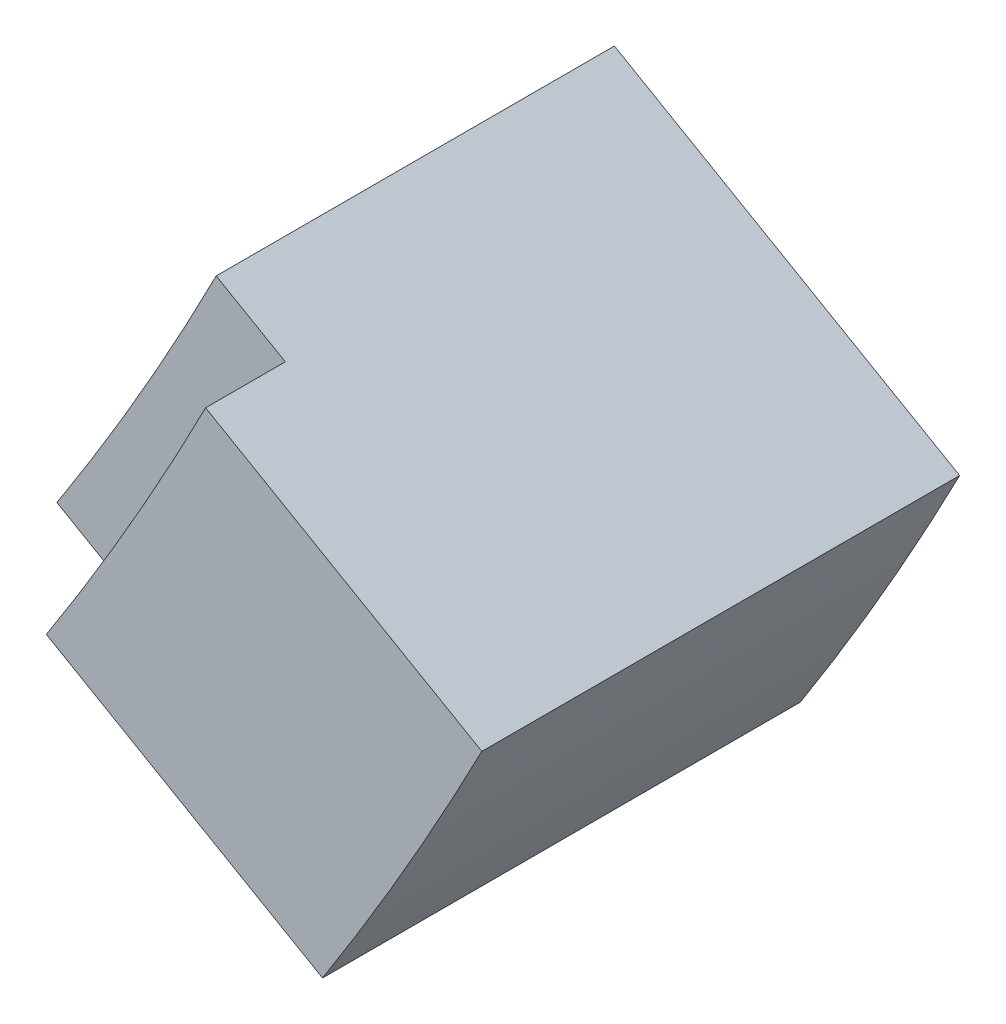
ISO-10303-21;
HEADER;
FILE_DESCRIPTION(('STEP AP214'),'2;1');
FILE_NAME('part.step','',(''),(''),'','','');
FILE_SCHEMA(('AUTOMOTIVE_DESIGN { 1 0 10303 214 1 1 1 1 }'));
ENDSEC;
DATA;
#1=APPLICATION_CONTEXT('core data for automotive mechanical design processes');
#2=APPLICATION_PROTOCOL_DEFINITION('international standard','automotive_design',2000,#1);
#3=PRODUCT_CONTEXT('',#1,'mechanical');
#4=PRODUCT('Part','Part','',(#3));
#5=PRODUCT_RELATED_PRODUCT_CATEGORY('part','',(#4));
#6=PRODUCT_DEFINITION_FORMATION('','',#4);
#7=PRODUCT_DEFINITION_CONTEXT('part definition',#1,'design');
#8=PRODUCT_DEFINITION('design','',#6,#7);
#9=PRODUCT_DEFINITION_SHAPE('','',#8);
#10=(LENGTH_UNIT() NAMED_UNIT(*) SI_UNIT(.MILLI.,.METRE.));
#11=(NAMED_UNIT(*) PLANE_ANGLE_UNIT() SI_UNIT($,.RADIAN.));
#12=(NAMED_UNIT(*) SI_UNIT($,.STERADIAN.) SOLID_ANGLE_UNIT());
#13=UNCERTAINTY_MEASURE_WITH_UNIT(LENGTH_MEASURE(1.E-05),#10,'distance_accuracy_value','');
#14=(GEOMETRIC_REPRESENTATION_CONTEXT(3) GLOBAL_UNCERTAINTY_ASSIGNED_CONTEXT((#13)) GLOBAL_UNIT_ASSIGNED_CONTEXT((#10,
#11,#12)) REPRESENTATION_CONTEXT('',''));
#15=CARTESIAN_POINT('',(0.,0.,0.));
#16=DIRECTION('',(0.,0.,1.));
#17=DIRECTION('',(1.,0.,0.));
#18=AXIS2_PLACEMENT_3D('',#15,#16,#17);
#19=CARTESIAN_POINT('',(0.,0.,25.));
#20=DIRECTION('',(0.,0.,-1.));
#21=DIRECTION('',(0.5,0.866025403784438,0.));
#22=AXIS2_PLACEMENT_3D('',#19,#20,#21);
#23=PLANE('',#22);
#24=CARTESIAN_POINT('',(0.,0.,25.));
#25=DIRECTION('',(0.,0.,-1.));
#26=DIRECTION('',(0.5,0.866025403784438,0.));
#27=AXIS2_PLACEMENT_3D('',#24,#25,#26);
#28=CIRCLE('',#27,200.);
#29=CARTESIAN_POINT('',(177.988438920062,-91.2146677393466,25.));
#30=VERTEX_POINT('',#29);
#31=CARTESIAN_POINT('',(167.988438920062,-108.535175815035,25.));
#32=VERTEX_POINT('',#31);
#33=EDGE_CURVE('E94',#30,#32,#28,.T.);
#34=ORIENTED_EDGE('',*,*,#33,.F.);
#35=DIRECTION('',(-0.866025403784438,0.5,0.));
#36=VECTOR('',#35,1.);
#37=CARTESIAN_POINT('',(195.328663106743,-101.226050841335,25.));
#38=LINE('',#37,#36);
#39=CARTESIAN_POINT('',(173.652749755229,-88.711456432908,25.));
#40=VERTEX_POINT('',#39);
#41=EDGE_CURVE('E46',#30,#40,#38,.T.);
#42=ORIENTED_EDGE('',*,*,#41,.T.);
#43=CARTESIAN_POINT('',(0.,0.,25.));
#44=DIRECTION('',(0.,0.,-1.));
#45=DIRECTION('',(-0.5,-0.866025403784438,0.));
#46=AXIS2_PLACEMENT_3D('',#43,#44,#45);
#47=CIRCLE('',#46,195.);
#48=CARTESIAN_POINT('',(163.652749755229,-106.031964508597,25.));
#49=VERTEX_POINT('',#48);
#50=EDGE_CURVE('E82',#40,#49,#47,.T.);
#51=ORIENTED_EDGE('',*,*,#50,.T.);
#52=DIRECTION('',(0.866025403784438,-0.5,0.));
#53=VECTOR('',#52,1.);
#54=CARTESIAN_POINT('',(163.652749755229,-106.031964508597,25.));
#55=LINE('',#54,#53);
#56=EDGE_CURVE('E38',#49,#32,#55,.T.);
#57=ORIENTED_EDGE('',*,*,#56,.T.);
#58=EDGE_LOOP('',(#34,#42,#51,#57));
#59=FACE_BOUND('',#58,.T.);
#60=ADVANCED_FACE('F17',(#59),#23,.F.);
#61=CARTESIAN_POINT('',(0.,0.,25.));
#62=DIRECTION('',(0.,0.,-1.));
#63=DIRECTION('',(0.5,0.866025403784438,0.));
#64=AXIS2_PLACEMENT_3D('',#61,#62,#63);
#65=CYLINDRICAL_SURFACE('',#64,195.);
#66=CARTESIAN_POINT('',(0.,0.,0.));
#67=DIRECTION('',(0.,0.,-1.));
#68=DIRECTION('',(-0.5,-0.866025403784438,0.));
#69=AXIS2_PLACEMENT_3D('',#66,#67,#68);
#70=CIRCLE('',#69,195.);
#71=CARTESIAN_POINT('',(173.652749755229,-88.711456432908,0.));
#72=VERTEX_POINT('',#71);
#73=CARTESIAN_POINT('',(163.652749755229,-106.031964508597,0.));
#74=VERTEX_POINT('',#73);
#75=EDGE_CURVE('E88',#72,#74,#70,.T.);
#76=ORIENTED_EDGE('',*,*,#75,.T.);
#77=DIRECTION('',(0.,0.,-1.));
#78=VECTOR('',#77,1.);
#79=CARTESIAN_POINT('',(163.652749755229,-106.031964508597,25.));
#80=LINE('',#79,#78);
#81=EDGE_CURVE('E11',#49,#74,#80,.T.);
#82=ORIENTED_EDGE('',*,*,#81,.F.);
#83=ORIENTED_EDGE('',*,*,#50,.F.);
#84=DIRECTION('',(0.,0.,-1.));
#85=VECTOR('',#84,1.);
#86=CARTESIAN_POINT('',(173.652749755229,-88.711456432908,25.));
#87=LINE('',#86,#85);
#88=EDGE_CURVE('E73',#40,#72,#87,.T.);
#89=ORIENTED_EDGE('',*,*,#88,.T.);
#90=EDGE_LOOP('',(#76,#82,#83,#89));
#91=FACE_BOUND('',#90,.T.);
#92=ADVANCED_FACE('F19',(#91),#65,.F.);
#93=CARTESIAN_POINT('',(163.652749755229,-106.031964508597,25.));
#94=DIRECTION('',(0.5,0.866025403784438,0.));
#95=DIRECTION('',(-0.866025403784438,0.5,0.));
#96=AXIS2_PLACEMENT_3D('',#93,#94,#95);
#97=PLANE('',#96);
#98=DIRECTION('',(0.,0.,-1.));
#99=VECTOR('',#98,1.);
#100=CARTESIAN_POINT('',(185.328663106743,-118.546558917024,25.));
#101=LINE('',#100,#99);
#102=CARTESIAN_POINT('',(185.328663106743,-118.546558917024,30.));
#103=VERTEX_POINT('',#102);
#104=CARTESIAN_POINT('',(185.328663106743,-118.546558917024,0.));
#105=VERTEX_POINT('',#104);
#106=EDGE_CURVE('E26',#103,#105,#101,.T.);
#107=ORIENTED_EDGE('',*,*,#106,.F.);
#108=DIRECTION('',(0.866025403784438,-0.5,0.));
#109=VECTOR('',#108,1.);
#110=CARTESIAN_POINT('',(167.988438920062,-108.535175815035,30.));
#111=LINE('',#110,#109);
#112=CARTESIAN_POINT('',(167.988438920062,-108.535175815035,30.));
#113=VERTEX_POINT('',#112);
#114=EDGE_CURVE('E138',#113,#103,#111,.T.);
#115=ORIENTED_EDGE('',*,*,#114,.F.);
#116=DIRECTION('',(0.,0.,-1.));
#117=VECTOR('',#116,1.);
#118=CARTESIAN_POINT('',(167.988438920062,-108.535175815035,30.));
#119=LINE('',#118,#117);
#120=EDGE_CURVE('E100',#113,#32,#119,.T.);
#121=ORIENTED_EDGE('',*,*,#120,.T.);
#122=ORIENTED_EDGE('',*,*,#56,.F.);
#123=ORIENTED_EDGE('',*,*,#81,.T.);
#124=DIRECTION('',(0.866025403784438,-0.5,0.));
#125=VECTOR('',#124,1.);
#126=CARTESIAN_POINT('',(163.652749755229,-106.031964508597,0.));
#127=LINE('',#126,#125);
#128=EDGE_CURVE('E92',#74,#105,#127,.T.);
#129=ORIENTED_EDGE('',*,*,#128,.T.);
#130=EDGE_LOOP('',(#107,#115,#121,#122,#123,#129));
#131=FACE_BOUND('',#130,.T.);
#132=ADVANCED_FACE('F154',(#131),#97,.F.);
#133=CARTESIAN_POINT('',(0.,0.,25.));
#134=DIRECTION('',(0.,0.,-1.));
#135=DIRECTION('',(0.5,0.866025403784438,0.));
#136=AXIS2_PLACEMENT_3D('',#133,#134,#135);
#137=CYLINDRICAL_SURFACE('',#136,220.);
#138=CARTESIAN_POINT('',(0.,0.,0.));
#139=DIRECTION('',(0.,0.,1.));
#140=DIRECTION('',(-0.5,-0.866025403784438,0.));
#141=AXIS2_PLACEMENT_3D('',#138,#139,#140);
#142=CIRCLE('',#141,220.);
#143=CARTESIAN_POINT('',(195.328663106743,-101.226050841335,0.));
#144=VERTEX_POINT('',#143);
#145=EDGE_CURVE('E83',#105,#144,#142,.T.);
#146=ORIENTED_EDGE('',*,*,#145,.T.);
#147=DIRECTION('',(0.,0.,-1.));
#148=VECTOR('',#147,1.);
#149=CARTESIAN_POINT('',(195.328663106743,-101.226050841335,25.));
#150=LINE('',#149,#148);
#151=CARTESIAN_POINT('',(195.328663106743,-101.226050841335,30.));
#152=VERTEX_POINT('',#151);
#153=EDGE_CURVE('E77',#152,#144,#150,.T.);
#154=ORIENTED_EDGE('',*,*,#153,.F.);
#155=CARTESIAN_POINT('',(0.,0.,30.));
#156=DIRECTION('',(0.,0.,1.));
#157=DIRECTION('',(-0.5,-0.866025403784438,0.));
#158=AXIS2_PLACEMENT_3D('',#155,#156,#157);
#159=CIRCLE('',#158,220.);
#160=EDGE_CURVE('E114',#103,#152,#159,.T.);
#161=ORIENTED_EDGE('',*,*,#160,.F.);
#162=ORIENTED_EDGE('',*,*,#106,.T.);
#163=EDGE_LOOP('',(#146,#154,#161,#162));
#164=FACE_BOUND('',#163,.T.);
#165=ADVANCED_FACE('F111',(#164),#137,.T.);
#166=CARTESIAN_POINT('',(195.328663106743,-101.226050841335,25.));
#167=DIRECTION('',(-0.5,-0.866025403784438,0.));
#168=DIRECTION('',(0.866025403784438,-0.5,0.));
#169=AXIS2_PLACEMENT_3D('',#166,#167,#168);
#170=PLANE('',#169);
#171=DIRECTION('',(-0.866025403784438,0.5,0.));
#172=VECTOR('',#171,1.);
#173=CARTESIAN_POINT('',(195.328663106743,-101.226050841335,0.));
#174=LINE('',#173,#172);
#175=EDGE_CURVE('E70',#144,#72,#174,.T.);
#176=ORIENTED_EDGE('',*,*,#175,.T.);
#177=ORIENTED_EDGE('',*,*,#88,.F.);
#178=ORIENTED_EDGE('',*,*,#41,.F.);
#179=DIRECTION('',(0.,0.,-1.));
#180=VECTOR('',#179,1.);
#181=CARTESIAN_POINT('',(177.988438920062,-91.2146677393466,30.));
#182=LINE('',#181,#180);
#183=CARTESIAN_POINT('',(177.988438920062,-91.2146677393466,30.));
#184=VERTEX_POINT('',#183);
#185=EDGE_CURVE('E130',#184,#30,#182,.T.);
#186=ORIENTED_EDGE('',*,*,#185,.F.);
#187=DIRECTION('',(-0.866025403784438,0.5,0.));
#188=VECTOR('',#187,1.);
#189=CARTESIAN_POINT('',(195.328663106743,-101.226050841335,30.));
#190=LINE('',#189,#188);
#191=EDGE_CURVE('E134',#152,#184,#190,.T.);
#192=ORIENTED_EDGE('',*,*,#191,.F.);
#193=ORIENTED_EDGE('',*,*,#153,.T.);
#194=EDGE_LOOP('',(#176,#177,#178,#186,#192,#193));
#195=FACE_BOUND('',#194,.T.);
#196=ADVANCED_FACE('F72',(#195),#170,.F.);
#197=CARTESIAN_POINT('',(0.,0.,0.));
#198=DIRECTION('',(0.,0.,-1.));
#199=DIRECTION('',(0.5,0.866025403784438,0.));
#200=AXIS2_PLACEMENT_3D('',#197,#198,#199);
#201=PLANE('',#200);
#202=ORIENTED_EDGE('',*,*,#145,.F.);
#203=ORIENTED_EDGE('',*,*,#128,.F.);
#204=ORIENTED_EDGE('',*,*,#75,.F.);
#205=ORIENTED_EDGE('',*,*,#175,.F.);
#206=EDGE_LOOP('',(#202,#203,#204,#205));
#207=FACE_BOUND('',#206,.T.);
#208=ADVANCED_FACE('F91',(#207),#201,.T.);
#209=CARTESIAN_POINT('',(0.,0.,30.));
#210=DIRECTION('',(0.,0.,-1.));
#211=DIRECTION('',(0.5,0.866025403784438,0.));
#212=AXIS2_PLACEMENT_3D('',#209,#210,#211);
#213=CYLINDRICAL_SURFACE('',#212,200.);
#214=ORIENTED_EDGE('',*,*,#185,.T.);
#215=ORIENTED_EDGE('',*,*,#33,.T.);
#216=ORIENTED_EDGE('',*,*,#120,.F.);
#217=CARTESIAN_POINT('',(0.,0.,30.));
#218=DIRECTION('',(0.,0.,-1.));
#219=DIRECTION('',(-0.5,-0.866025403784438,0.));
#220=AXIS2_PLACEMENT_3D('',#217,#218,#219);
#221=CIRCLE('',#220,200.);
#222=EDGE_CURVE('E135',#184,#113,#221,.T.);
#223=ORIENTED_EDGE('',*,*,#222,.F.);
#224=EDGE_LOOP('',(#214,#215,#216,#223));
#225=FACE_BOUND('',#224,.T.);
#226=ADVANCED_FACE('F167',(#225),#213,.F.);
#227=CARTESIAN_POINT('',(0.,0.,30.));
#228=DIRECTION('',(0.,0.,-1.));
#229=DIRECTION('',(0.5,0.866025403784438,0.));
#230=AXIS2_PLACEMENT_3D('',#227,#228,#229);
#231=PLANE('',#230);
#232=ORIENTED_EDGE('',*,*,#222,.T.);
#233=ORIENTED_EDGE('',*,*,#114,.T.);
#234=ORIENTED_EDGE('',*,*,#160,.T.);
#235=ORIENTED_EDGE('',*,*,#191,.T.);
#236=EDGE_LOOP('',(#232,#233,#234,#235));
#237=FACE_BOUND('',#236,.T.);
#238=ADVANCED_FACE('F147',(#237),#231,.F.);
#239=CLOSED_SHELL('',(#60,#92,#132,#165,#196,#208,#226,#238));
#240=MANIFOLD_SOLID_BREP('B1',#239);
#241=ADVANCED_BREP_SHAPE_REPRESENTATION('',(#18,#240),#14);
#242=SHAPE_DEFINITION_REPRESENTATION(#9,#241);
ENDSEC;
END-ISO-10303-21;
